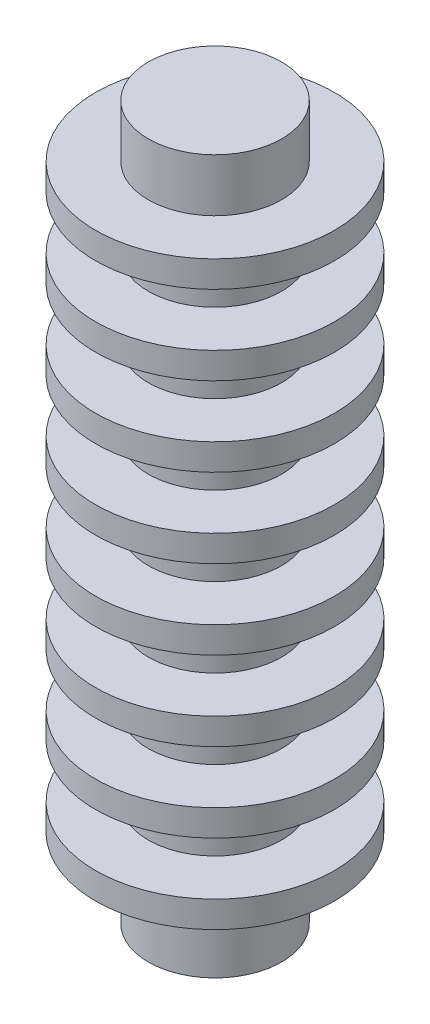
ISO-10303-21;
HEADER;
FILE_DESCRIPTION(('STEP AP214'),'2;1');
FILE_NAME('part.step','',(''),(''),'','','');
FILE_SCHEMA(('AUTOMOTIVE_DESIGN { 1 0 10303 214 1 1 1 1 }'));
ENDSEC;
DATA;
#1=APPLICATION_CONTEXT('core data for automotive mechanical design processes');
#2=APPLICATION_PROTOCOL_DEFINITION('international standard','automotive_design',2000,#1);
#3=PRODUCT_CONTEXT('',#1,'mechanical');
#4=PRODUCT('Part','Part','',(#3));
#5=PRODUCT_RELATED_PRODUCT_CATEGORY('part','',(#4));
#6=PRODUCT_DEFINITION_FORMATION('','',#4);
#7=PRODUCT_DEFINITION_CONTEXT('part definition',#1,'design');
#8=PRODUCT_DEFINITION('design','',#6,#7);
#9=PRODUCT_DEFINITION_SHAPE('','',#8);
#10=(LENGTH_UNIT() NAMED_UNIT(*) SI_UNIT(.MILLI.,.METRE.));
#11=(NAMED_UNIT(*) PLANE_ANGLE_UNIT() SI_UNIT($,.RADIAN.));
#12=(NAMED_UNIT(*) SI_UNIT($,.STERADIAN.) SOLID_ANGLE_UNIT());
#13=UNCERTAINTY_MEASURE_WITH_UNIT(LENGTH_MEASURE(1.E-05),#10,'distance_accuracy_value','');
#14=(GEOMETRIC_REPRESENTATION_CONTEXT(3) GLOBAL_UNCERTAINTY_ASSIGNED_CONTEXT((#13)) GLOBAL_UNIT_ASSIGNED_CONTEXT((#10,
#11,#12)) REPRESENTATION_CONTEXT('',''));
#15=CARTESIAN_POINT('',(0.,0.,0.));
#16=DIRECTION('',(0.,0.,1.));
#17=DIRECTION('',(1.,0.,0.));
#18=AXIS2_PLACEMENT_3D('',#15,#16,#17);
#19=CARTESIAN_POINT('',(5.05,27.,0.));
#20=DIRECTION('',(0.,-1.,0.));
#21=DIRECTION('',(1.,0.,0.));
#22=AXIS2_PLACEMENT_3D('',#19,#20,#21);
#23=PLANE('',#22);
#24=CARTESIAN_POINT('',(0.,27.,0.));
#25=DIRECTION('',(0.,1.,0.));
#26=DIRECTION('',(-1.,0.,0.));
#27=AXIS2_PLACEMENT_3D('',#24,#25,#26);
#28=CIRCLE('',#27,5.04999999999999);
#29=CARTESIAN_POINT('',(-5.04999999999998,27.,0.));
#30=VERTEX_POINT('',#29);
#31=EDGE_CURVE('E10',#30,#30,#28,.T.);
#32=ORIENTED_EDGE('',*,*,#31,.T.);
#33=EDGE_LOOP('',(#32));
#34=FACE_BOUND('',#33,.T.);
#35=ADVANCED_FACE('F41',(#34),#23,.F.);
#36=CARTESIAN_POINT('',(0.,27.,0.));
#37=DIRECTION('',(0.,1.,0.));
#38=DIRECTION('',(-1.,0.,0.));
#39=AXIS2_PLACEMENT_3D('',#36,#37,#38);
#40=CYLINDRICAL_SURFACE('',#39,5.04999999999999);
#41=ORIENTED_EDGE('',*,*,#31,.F.);
#42=EDGE_LOOP('',(#41));
#43=FACE_BOUND('',#42,.T.);
#44=CARTESIAN_POINT('',(0.,23.,0.));
#45=DIRECTION('',(0.,1.,0.));
#46=DIRECTION('',(-1.,0.,0.));
#47=AXIS2_PLACEMENT_3D('',#44,#45,#46);
#48=CIRCLE('',#47,5.04999999999999);
#49=CARTESIAN_POINT('',(-5.04999999999998,23.,0.));
#50=VERTEX_POINT('',#49);
#51=EDGE_CURVE('E47',#50,#50,#48,.T.);
#52=ORIENTED_EDGE('',*,*,#51,.T.);
#53=EDGE_LOOP('',(#52));
#54=FACE_BOUND('',#53,.T.);
#55=ADVANCED_FACE('F163',(#43,#54),#40,.T.);
#56=CARTESIAN_POINT('',(5.05,23.,0.));
#57=DIRECTION('',(0.,-1.,0.));
#58=DIRECTION('',(1.,0.,0.));
#59=AXIS2_PLACEMENT_3D('',#56,#57,#58);
#60=PLANE('',#59);
#61=ORIENTED_EDGE('',*,*,#51,.F.);
#62=EDGE_LOOP('',(#61));
#63=FACE_BOUND('',#62,.T.);
#64=CARTESIAN_POINT('',(0.,23.,0.));
#65=DIRECTION('',(0.,1.,0.));
#66=DIRECTION('',(-1.,0.,0.));
#67=AXIS2_PLACEMENT_3D('',#64,#65,#66);
#68=CIRCLE('',#67,9.04999999999999);
#69=CARTESIAN_POINT('',(-9.04999999999998,23.,0.));
#70=VERTEX_POINT('',#69);
#71=EDGE_CURVE('E51',#70,#70,#68,.T.);
#72=ORIENTED_EDGE('',*,*,#71,.T.);
#73=EDGE_LOOP('',(#72));
#74=FACE_BOUND('',#73,.T.);
#75=ADVANCED_FACE('F167',(#63,#74),#60,.F.);
#76=CARTESIAN_POINT('',(0.,27.,0.));
#77=DIRECTION('',(0.,1.,0.));
#78=DIRECTION('',(-1.,0.,0.));
#79=AXIS2_PLACEMENT_3D('',#76,#77,#78);
#80=CYLINDRICAL_SURFACE('',#79,9.05);
#81=ORIENTED_EDGE('',*,*,#71,.F.);
#82=EDGE_LOOP('',(#81));
#83=FACE_BOUND('',#82,.T.);
#84=CARTESIAN_POINT('',(0.,21.,0.));
#85=DIRECTION('',(0.,1.,0.));
#86=DIRECTION('',(-1.,0.,0.));
#87=AXIS2_PLACEMENT_3D('',#84,#85,#86);
#88=CIRCLE('',#87,9.04999999999999);
#89=CARTESIAN_POINT('',(-9.04999999999998,21.,0.));
#90=VERTEX_POINT('',#89);
#91=EDGE_CURVE('E55',#90,#90,#88,.T.);
#92=ORIENTED_EDGE('',*,*,#91,.T.);
#93=EDGE_LOOP('',(#92));
#94=FACE_BOUND('',#93,.T.);
#95=ADVANCED_FACE('F172',(#83,#94),#80,.T.);
#96=CARTESIAN_POINT('',(9.05,21.,0.));
#97=DIRECTION('',(0.,1.,0.));
#98=DIRECTION('',(-1.,0.,0.));
#99=AXIS2_PLACEMENT_3D('',#96,#97,#98);
#100=PLANE('',#99);
#101=ORIENTED_EDGE('',*,*,#91,.F.);
#102=EDGE_LOOP('',(#101));
#103=FACE_BOUND('',#102,.T.);
#104=CARTESIAN_POINT('',(0.,21.,0.));
#105=DIRECTION('',(0.,1.,0.));
#106=DIRECTION('',(-1.,0.,0.));
#107=AXIS2_PLACEMENT_3D('',#104,#105,#106);
#108=CIRCLE('',#107,5.04999999999999);
#109=CARTESIAN_POINT('',(-5.04999999999998,21.,0.));
#110=VERTEX_POINT('',#109);
#111=EDGE_CURVE('E60',#110,#110,#108,.T.);
#112=ORIENTED_EDGE('',*,*,#111,.T.);
#113=EDGE_LOOP('',(#112));
#114=FACE_BOUND('',#113,.T.);
#115=ADVANCED_FACE('F178',(#103,#114),#100,.F.);
#116=CARTESIAN_POINT('',(0.,27.,0.));
#117=DIRECTION('',(0.,1.,0.));
#118=DIRECTION('',(-1.,0.,0.));
#119=AXIS2_PLACEMENT_3D('',#116,#117,#118);
#120=CYLINDRICAL_SURFACE('',#119,5.04999999999981);
#121=ORIENTED_EDGE('',*,*,#111,.F.);
#122=EDGE_LOOP('',(#121));
#123=FACE_BOUND('',#122,.T.);
#124=CARTESIAN_POINT('',(0.,17.,0.));
#125=DIRECTION('',(0.,1.,0.));
#126=DIRECTION('',(-1.,0.,0.));
#127=AXIS2_PLACEMENT_3D('',#124,#125,#126);
#128=CIRCLE('',#127,5.05000000000005);
#129=CARTESIAN_POINT('',(-5.05000000000005,17.,0.));
#130=VERTEX_POINT('',#129);
#131=EDGE_CURVE('E63',#130,#130,#128,.T.);
#132=ORIENTED_EDGE('',*,*,#131,.T.);
#133=EDGE_LOOP('',(#132));
#134=FACE_BOUND('',#133,.T.);
#135=ADVANCED_FACE('F182',(#123,#134),#120,.T.);
#136=CARTESIAN_POINT('',(5.05000000000006,17.,0.));
#137=DIRECTION('',(0.,-1.,0.));
#138=DIRECTION('',(1.,0.,0.));
#139=AXIS2_PLACEMENT_3D('',#136,#137,#138);
#140=PLANE('',#139);
#141=ORIENTED_EDGE('',*,*,#131,.F.);
#142=EDGE_LOOP('',(#141));
#143=FACE_BOUND('',#142,.T.);
#144=CARTESIAN_POINT('',(0.,17.,0.));
#145=DIRECTION('',(0.,1.,0.));
#146=DIRECTION('',(-1.,0.,0.));
#147=AXIS2_PLACEMENT_3D('',#144,#145,#146);
#148=CIRCLE('',#147,9.05000000000006);
#149=CARTESIAN_POINT('',(-9.05000000000005,17.,0.));
#150=VERTEX_POINT('',#149);
#151=EDGE_CURVE('E66',#150,#150,#148,.T.);
#152=ORIENTED_EDGE('',*,*,#151,.T.);
#153=EDGE_LOOP('',(#152));
#154=FACE_BOUND('',#153,.T.);
#155=ADVANCED_FACE('F186',(#143,#154),#140,.F.);
#156=CARTESIAN_POINT('',(0.,27.,0.));
#157=DIRECTION('',(0.,1.,0.));
#158=DIRECTION('',(-1.,0.,0.));
#159=AXIS2_PLACEMENT_3D('',#156,#157,#158);
#160=CYLINDRICAL_SURFACE('',#159,9.05000000000006);
#161=ORIENTED_EDGE('',*,*,#151,.F.);
#162=EDGE_LOOP('',(#161));
#163=FACE_BOUND('',#162,.T.);
#164=CARTESIAN_POINT('',(0.,15.,0.));
#165=DIRECTION('',(0.,1.,0.));
#166=DIRECTION('',(-1.,0.,0.));
#167=AXIS2_PLACEMENT_3D('',#164,#165,#166);
#168=CIRCLE('',#167,9.05000000000006);
#169=CARTESIAN_POINT('',(-9.05000000000005,15.,0.));
#170=VERTEX_POINT('',#169);
#171=EDGE_CURVE('E69',#170,#170,#168,.T.);
#172=ORIENTED_EDGE('',*,*,#171,.T.);
#173=EDGE_LOOP('',(#172));
#174=FACE_BOUND('',#173,.T.);
#175=ADVANCED_FACE('F190',(#163,#174),#160,.T.);
#176=CARTESIAN_POINT('',(9.05000000000007,15.,0.));
#177=DIRECTION('',(0.,1.,0.));
#178=DIRECTION('',(-1.,0.,0.));
#179=AXIS2_PLACEMENT_3D('',#176,#177,#178);
#180=PLANE('',#179);
#181=ORIENTED_EDGE('',*,*,#171,.F.);
#182=EDGE_LOOP('',(#181));
#183=FACE_BOUND('',#182,.T.);
#184=CARTESIAN_POINT('',(0.,15.,0.));
#185=DIRECTION('',(0.,1.,0.));
#186=DIRECTION('',(-1.,0.,0.));
#187=AXIS2_PLACEMENT_3D('',#184,#185,#186);
#188=CIRCLE('',#187,5.05000000000005);
#189=CARTESIAN_POINT('',(-5.05000000000005,15.,0.));
#190=VERTEX_POINT('',#189);
#191=EDGE_CURVE('E72',#190,#190,#188,.T.);
#192=ORIENTED_EDGE('',*,*,#191,.T.);
#193=EDGE_LOOP('',(#192));
#194=FACE_BOUND('',#193,.T.);
#195=ADVANCED_FACE('F194',(#183,#194),#180,.F.);
#196=CARTESIAN_POINT('',(0.,27.,0.));
#197=DIRECTION('',(0.,1.,0.));
#198=DIRECTION('',(-1.,0.,0.));
#199=AXIS2_PLACEMENT_3D('',#196,#197,#198);
#200=CYLINDRICAL_SURFACE('',#199,5.05000000000012);
#201=ORIENTED_EDGE('',*,*,#191,.F.);
#202=EDGE_LOOP('',(#201));
#203=FACE_BOUND('',#202,.T.);
#204=CARTESIAN_POINT('',(0.,11.,0.));
#205=DIRECTION('',(0.,1.,0.));
#206=DIRECTION('',(-1.,0.,0.));
#207=AXIS2_PLACEMENT_3D('',#204,#205,#206);
#208=CIRCLE('',#207,5.05000000000012);
#209=CARTESIAN_POINT('',(-5.05000000000011,11.,0.));
#210=VERTEX_POINT('',#209);
#211=EDGE_CURVE('E75',#210,#210,#208,.T.);
#212=ORIENTED_EDGE('',*,*,#211,.T.);
#213=EDGE_LOOP('',(#212));
#214=FACE_BOUND('',#213,.T.);
#215=ADVANCED_FACE('F198',(#203,#214),#200,.T.);
#216=CARTESIAN_POINT('',(5.05000000000013,11.,0.));
#217=DIRECTION('',(0.,-1.,0.));
#218=DIRECTION('',(1.,0.,0.));
#219=AXIS2_PLACEMENT_3D('',#216,#217,#218);
#220=PLANE('',#219);
#221=ORIENTED_EDGE('',*,*,#211,.F.);
#222=EDGE_LOOP('',(#221));
#223=FACE_BOUND('',#222,.T.);
#224=CARTESIAN_POINT('',(0.,11.,0.));
#225=DIRECTION('',(0.,1.,0.));
#226=DIRECTION('',(-1.,0.,0.));
#227=AXIS2_PLACEMENT_3D('',#224,#225,#226);
#228=CIRCLE('',#227,9.05000000000012);
#229=CARTESIAN_POINT('',(-9.05000000000011,11.,0.));
#230=VERTEX_POINT('',#229);
#231=EDGE_CURVE('E78',#230,#230,#228,.T.);
#232=ORIENTED_EDGE('',*,*,#231,.T.);
#233=EDGE_LOOP('',(#232));
#234=FACE_BOUND('',#233,.T.);
#235=ADVANCED_FACE('F202',(#223,#234),#220,.F.);
#236=CARTESIAN_POINT('',(0.,27.,0.));
#237=DIRECTION('',(0.,1.,0.));
#238=DIRECTION('',(-1.,0.,0.));
#239=AXIS2_PLACEMENT_3D('',#236,#237,#238);
#240=CYLINDRICAL_SURFACE('',#239,9.05000000000012);
#241=ORIENTED_EDGE('',*,*,#231,.F.);
#242=EDGE_LOOP('',(#241));
#243=FACE_BOUND('',#242,.T.);
#244=CARTESIAN_POINT('',(0.,9.,0.));
#245=DIRECTION('',(0.,1.,0.));
#246=DIRECTION('',(-1.,0.,0.));
#247=AXIS2_PLACEMENT_3D('',#244,#245,#246);
#248=CIRCLE('',#247,9.05000000000012);
#249=CARTESIAN_POINT('',(-9.05000000000011,9.,0.));
#250=VERTEX_POINT('',#249);
#251=EDGE_CURVE('E81',#250,#250,#248,.T.);
#252=ORIENTED_EDGE('',*,*,#251,.T.);
#253=EDGE_LOOP('',(#252));
#254=FACE_BOUND('',#253,.T.);
#255=ADVANCED_FACE('F206',(#243,#254),#240,.T.);
#256=CARTESIAN_POINT('',(9.05000000000013,9.,0.));
#257=DIRECTION('',(0.,1.,0.));
#258=DIRECTION('',(-1.,0.,0.));
#259=AXIS2_PLACEMENT_3D('',#256,#257,#258);
#260=PLANE('',#259);
#261=ORIENTED_EDGE('',*,*,#251,.F.);
#262=EDGE_LOOP('',(#261));
#263=FACE_BOUND('',#262,.T.);
#264=CARTESIAN_POINT('',(0.,8.99999999999999,0.));
#265=DIRECTION('',(0.,1.,0.));
#266=DIRECTION('',(-1.,0.,0.));
#267=AXIS2_PLACEMENT_3D('',#264,#265,#266);
#268=CIRCLE('',#267,5.05000000000012);
#269=CARTESIAN_POINT('',(-5.05000000000011,8.99999999999999,0.));
#270=VERTEX_POINT('',#269);
#271=EDGE_CURVE('E84',#270,#270,#268,.T.);
#272=ORIENTED_EDGE('',*,*,#271,.T.);
#273=EDGE_LOOP('',(#272));
#274=FACE_BOUND('',#273,.T.);
#275=ADVANCED_FACE('F210',(#263,#274),#260,.F.);
#276=CARTESIAN_POINT('',(0.,27.,0.));
#277=DIRECTION('',(0.,1.,0.));
#278=DIRECTION('',(-1.,0.,0.));
#279=AXIS2_PLACEMENT_3D('',#276,#277,#278);
#280=CYLINDRICAL_SURFACE('',#279,5.05000000000018);
#281=ORIENTED_EDGE('',*,*,#271,.F.);
#282=EDGE_LOOP('',(#281));
#283=FACE_BOUND('',#282,.T.);
#284=CARTESIAN_POINT('',(0.,5.,0.));
#285=DIRECTION('',(0.,1.,0.));
#286=DIRECTION('',(-1.,0.,0.));
#287=AXIS2_PLACEMENT_3D('',#284,#285,#286);
#288=CIRCLE('',#287,5.05000000000018);
#289=CARTESIAN_POINT('',(-5.05000000000017,5.,0.));
#290=VERTEX_POINT('',#289);
#291=EDGE_CURVE('E87',#290,#290,#288,.T.);
#292=ORIENTED_EDGE('',*,*,#291,.T.);
#293=EDGE_LOOP('',(#292));
#294=FACE_BOUND('',#293,.T.);
#295=ADVANCED_FACE('F214',(#283,#294),#280,.T.);
#296=CARTESIAN_POINT('',(5.05000000000019,5.,0.));
#297=DIRECTION('',(0.,-1.,0.));
#298=DIRECTION('',(1.,0.,0.));
#299=AXIS2_PLACEMENT_3D('',#296,#297,#298);
#300=PLANE('',#299);
#301=ORIENTED_EDGE('',*,*,#291,.F.);
#302=EDGE_LOOP('',(#301));
#303=FACE_BOUND('',#302,.T.);
#304=CARTESIAN_POINT('',(0.,5.,0.));
#305=DIRECTION('',(0.,1.,0.));
#306=DIRECTION('',(-1.,0.,0.));
#307=AXIS2_PLACEMENT_3D('',#304,#305,#306);
#308=CIRCLE('',#307,9.05000000000019);
#309=CARTESIAN_POINT('',(-9.05000000000018,5.,0.));
#310=VERTEX_POINT('',#309);
#311=EDGE_CURVE('E90',#310,#310,#308,.T.);
#312=ORIENTED_EDGE('',*,*,#311,.T.);
#313=EDGE_LOOP('',(#312));
#314=FACE_BOUND('',#313,.T.);
#315=ADVANCED_FACE('F218',(#303,#314),#300,.F.);
#316=CARTESIAN_POINT('',(0.,27.,0.));
#317=DIRECTION('',(0.,1.,0.));
#318=DIRECTION('',(-1.,0.,0.));
#319=AXIS2_PLACEMENT_3D('',#316,#317,#318);
#320=CYLINDRICAL_SURFACE('',#319,9.05000000000019);
#321=ORIENTED_EDGE('',*,*,#311,.F.);
#322=EDGE_LOOP('',(#321));
#323=FACE_BOUND('',#322,.T.);
#324=CARTESIAN_POINT('',(0.,3.,0.));
#325=DIRECTION('',(0.,1.,0.));
#326=DIRECTION('',(-1.,0.,0.));
#327=AXIS2_PLACEMENT_3D('',#324,#325,#326);
#328=CIRCLE('',#327,9.05000000000019);
#329=CARTESIAN_POINT('',(-9.05000000000018,3.,0.));
#330=VERTEX_POINT('',#329);
#331=EDGE_CURVE('E93',#330,#330,#328,.T.);
#332=ORIENTED_EDGE('',*,*,#331,.T.);
#333=EDGE_LOOP('',(#332));
#334=FACE_BOUND('',#333,.T.);
#335=ADVANCED_FACE('F222',(#323,#334),#320,.T.);
#336=CARTESIAN_POINT('',(9.05000000000019,3.,0.));
#337=DIRECTION('',(0.,1.,0.));
#338=DIRECTION('',(-1.,0.,0.));
#339=AXIS2_PLACEMENT_3D('',#336,#337,#338);
#340=PLANE('',#339);
#341=ORIENTED_EDGE('',*,*,#331,.F.);
#342=EDGE_LOOP('',(#341));
#343=FACE_BOUND('',#342,.T.);
#344=CARTESIAN_POINT('',(0.,3.,0.));
#345=DIRECTION('',(0.,1.,0.));
#346=DIRECTION('',(-1.,0.,0.));
#347=AXIS2_PLACEMENT_3D('',#344,#345,#346);
#348=CIRCLE('',#347,5.05000000000018);
#349=CARTESIAN_POINT('',(-5.05000000000017,3.,0.));
#350=VERTEX_POINT('',#349);
#351=EDGE_CURVE('E96',#350,#350,#348,.T.);
#352=ORIENTED_EDGE('',*,*,#351,.T.);
#353=EDGE_LOOP('',(#352));
#354=FACE_BOUND('',#353,.T.);
#355=ADVANCED_FACE('F226',(#343,#354),#340,.F.);
#356=CARTESIAN_POINT('',(0.,27.,0.));
#357=DIRECTION('',(0.,1.,0.));
#358=DIRECTION('',(-1.,0.,0.));
#359=AXIS2_PLACEMENT_3D('',#356,#357,#358);
#360=CYLINDRICAL_SURFACE('',#359,5.05000000000024);
#361=ORIENTED_EDGE('',*,*,#351,.F.);
#362=EDGE_LOOP('',(#361));
#363=FACE_BOUND('',#362,.T.);
#364=CARTESIAN_POINT('',(0.,-1.,0.));
#365=DIRECTION('',(0.,1.,0.));
#366=DIRECTION('',(-1.,0.,0.));
#367=AXIS2_PLACEMENT_3D('',#364,#365,#366);
#368=CIRCLE('',#367,5.05000000000024);
#369=CARTESIAN_POINT('',(-5.05000000000024,-1.,0.));
#370=VERTEX_POINT('',#369);
#371=EDGE_CURVE('E99',#370,#370,#368,.T.);
#372=ORIENTED_EDGE('',*,*,#371,.T.);
#373=EDGE_LOOP('',(#372));
#374=FACE_BOUND('',#373,.T.);
#375=ADVANCED_FACE('F230',(#363,#374),#360,.T.);
#376=CARTESIAN_POINT('',(5.05000000000025,-1.,0.));
#377=DIRECTION('',(0.,-1.,0.));
#378=DIRECTION('',(1.,0.,0.));
#379=AXIS2_PLACEMENT_3D('',#376,#377,#378);
#380=PLANE('',#379);
#381=ORIENTED_EDGE('',*,*,#371,.F.);
#382=EDGE_LOOP('',(#381));
#383=FACE_BOUND('',#382,.T.);
#384=CARTESIAN_POINT('',(0.,-1.,0.));
#385=DIRECTION('',(0.,1.,0.));
#386=DIRECTION('',(-1.,0.,0.));
#387=AXIS2_PLACEMENT_3D('',#384,#385,#386);
#388=CIRCLE('',#387,9.05000000000025);
#389=CARTESIAN_POINT('',(-9.05000000000024,-1.,0.));
#390=VERTEX_POINT('',#389);
#391=EDGE_CURVE('E102',#390,#390,#388,.T.);
#392=ORIENTED_EDGE('',*,*,#391,.T.);
#393=EDGE_LOOP('',(#392));
#394=FACE_BOUND('',#393,.T.);
#395=ADVANCED_FACE('F234',(#383,#394),#380,.F.);
#396=CARTESIAN_POINT('',(0.,27.,0.));
#397=DIRECTION('',(0.,1.,0.));
#398=DIRECTION('',(-1.,0.,0.));
#399=AXIS2_PLACEMENT_3D('',#396,#397,#398);
#400=CYLINDRICAL_SURFACE('',#399,9.05000000000025);
#401=ORIENTED_EDGE('',*,*,#391,.F.);
#402=EDGE_LOOP('',(#401));
#403=FACE_BOUND('',#402,.T.);
#404=CARTESIAN_POINT('',(0.,-3.,0.));
#405=DIRECTION('',(0.,1.,0.));
#406=DIRECTION('',(-1.,0.,0.));
#407=AXIS2_PLACEMENT_3D('',#404,#405,#406);
#408=CIRCLE('',#407,9.05000000000025);
#409=CARTESIAN_POINT('',(-9.05000000000024,-3.,0.));
#410=VERTEX_POINT('',#409);
#411=EDGE_CURVE('E105',#410,#410,#408,.T.);
#412=ORIENTED_EDGE('',*,*,#411,.T.);
#413=EDGE_LOOP('',(#412));
#414=FACE_BOUND('',#413,.T.);
#415=ADVANCED_FACE('F238',(#403,#414),#400,.T.);
#416=CARTESIAN_POINT('',(9.05000000000025,-3.,0.));
#417=DIRECTION('',(0.,1.,0.));
#418=DIRECTION('',(-1.,0.,0.));
#419=AXIS2_PLACEMENT_3D('',#416,#417,#418);
#420=PLANE('',#419);
#421=ORIENTED_EDGE('',*,*,#411,.F.);
#422=EDGE_LOOP('',(#421));
#423=FACE_BOUND('',#422,.T.);
#424=CARTESIAN_POINT('',(0.,-3.,0.));
#425=DIRECTION('',(0.,1.,0.));
#426=DIRECTION('',(-1.,0.,0.));
#427=AXIS2_PLACEMENT_3D('',#424,#425,#426);
#428=CIRCLE('',#427,5.05000000000024);
#429=CARTESIAN_POINT('',(-5.05000000000024,-3.,0.));
#430=VERTEX_POINT('',#429);
#431=EDGE_CURVE('E108',#430,#430,#428,.T.);
#432=ORIENTED_EDGE('',*,*,#431,.T.);
#433=EDGE_LOOP('',(#432));
#434=FACE_BOUND('',#433,.T.);
#435=ADVANCED_FACE('F242',(#423,#434),#420,.F.);
#436=CARTESIAN_POINT('',(0.,27.,0.));
#437=DIRECTION('',(0.,1.,0.));
#438=DIRECTION('',(-1.,0.,0.));
#439=AXIS2_PLACEMENT_3D('',#436,#437,#438);
#440=CYLINDRICAL_SURFACE('',#439,5.05000000000031);
#441=ORIENTED_EDGE('',*,*,#431,.F.);
#442=EDGE_LOOP('',(#441));
#443=FACE_BOUND('',#442,.T.);
#444=CARTESIAN_POINT('',(0.,-7.,0.));
#445=DIRECTION('',(0.,1.,0.));
#446=DIRECTION('',(-1.,0.,0.));
#447=AXIS2_PLACEMENT_3D('',#444,#445,#446);
#448=CIRCLE('',#447,5.05000000000031);
#449=CARTESIAN_POINT('',(-5.0500000000003,-6.99999999999999,0.));
#450=VERTEX_POINT('',#449);
#451=EDGE_CURVE('E111',#450,#450,#448,.T.);
#452=ORIENTED_EDGE('',*,*,#451,.T.);
#453=EDGE_LOOP('',(#452));
#454=FACE_BOUND('',#453,.T.);
#455=ADVANCED_FACE('F246',(#443,#454),#440,.T.);
#456=CARTESIAN_POINT('',(5.05000000000031,-7.,0.));
#457=DIRECTION('',(0.,-1.,0.));
#458=DIRECTION('',(1.,0.,0.));
#459=AXIS2_PLACEMENT_3D('',#456,#457,#458);
#460=PLANE('',#459);
#461=ORIENTED_EDGE('',*,*,#451,.F.);
#462=EDGE_LOOP('',(#461));
#463=FACE_BOUND('',#462,.T.);
#464=CARTESIAN_POINT('',(0.,-7.,0.));
#465=DIRECTION('',(0.,1.,0.));
#466=DIRECTION('',(-1.,0.,0.));
#467=AXIS2_PLACEMENT_3D('',#464,#465,#466);
#468=CIRCLE('',#467,9.05000000000031);
#469=CARTESIAN_POINT('',(-9.05000000000031,-6.99999999999999,0.));
#470=VERTEX_POINT('',#469);
#471=EDGE_CURVE('E114',#470,#470,#468,.T.);
#472=ORIENTED_EDGE('',*,*,#471,.T.);
#473=EDGE_LOOP('',(#472));
#474=FACE_BOUND('',#473,.T.);
#475=ADVANCED_FACE('F250',(#463,#474),#460,.F.);
#476=CARTESIAN_POINT('',(0.,27.,0.));
#477=DIRECTION('',(0.,1.,0.));
#478=DIRECTION('',(-1.,0.,0.));
#479=AXIS2_PLACEMENT_3D('',#476,#477,#478);
#480=CYLINDRICAL_SURFACE('',#479,9.05000000000031);
#481=ORIENTED_EDGE('',*,*,#471,.F.);
#482=EDGE_LOOP('',(#481));
#483=FACE_BOUND('',#482,.T.);
#484=CARTESIAN_POINT('',(0.,-9.,0.));
#485=DIRECTION('',(0.,1.,0.));
#486=DIRECTION('',(-1.,0.,0.));
#487=AXIS2_PLACEMENT_3D('',#484,#485,#486);
#488=CIRCLE('',#487,9.05000000000031);
#489=CARTESIAN_POINT('',(-9.05000000000031,-9.,0.));
#490=VERTEX_POINT('',#489);
#491=EDGE_CURVE('E117',#490,#490,#488,.T.);
#492=ORIENTED_EDGE('',*,*,#491,.T.);
#493=EDGE_LOOP('',(#492));
#494=FACE_BOUND('',#493,.T.);
#495=ADVANCED_FACE('F254',(#483,#494),#480,.T.);
#496=CARTESIAN_POINT('',(9.05000000000032,-9.,0.));
#497=DIRECTION('',(0.,1.,0.));
#498=DIRECTION('',(-1.,0.,0.));
#499=AXIS2_PLACEMENT_3D('',#496,#497,#498);
#500=PLANE('',#499);
#501=ORIENTED_EDGE('',*,*,#491,.F.);
#502=EDGE_LOOP('',(#501));
#503=FACE_BOUND('',#502,.T.);
#504=CARTESIAN_POINT('',(0.,-9.,0.));
#505=DIRECTION('',(0.,1.,0.));
#506=DIRECTION('',(-1.,0.,0.));
#507=AXIS2_PLACEMENT_3D('',#504,#505,#506);
#508=CIRCLE('',#507,5.05000000000031);
#509=CARTESIAN_POINT('',(-5.0500000000003,-9.,0.));
#510=VERTEX_POINT('',#509);
#511=EDGE_CURVE('E120',#510,#510,#508,.T.);
#512=ORIENTED_EDGE('',*,*,#511,.T.);
#513=EDGE_LOOP('',(#512));
#514=FACE_BOUND('',#513,.T.);
#515=ADVANCED_FACE('F258',(#503,#514),#500,.F.);
#516=CARTESIAN_POINT('',(0.,27.,0.));
#517=DIRECTION('',(0.,1.,0.));
#518=DIRECTION('',(-1.,0.,0.));
#519=AXIS2_PLACEMENT_3D('',#516,#517,#518);
#520=CYLINDRICAL_SURFACE('',#519,5.05000000000037);
#521=ORIENTED_EDGE('',*,*,#511,.F.);
#522=EDGE_LOOP('',(#521));
#523=FACE_BOUND('',#522,.T.);
#524=CARTESIAN_POINT('',(0.,-13.,0.));
#525=DIRECTION('',(0.,1.,0.));
#526=DIRECTION('',(-1.,0.,0.));
#527=AXIS2_PLACEMENT_3D('',#524,#525,#526);
#528=CIRCLE('',#527,5.05000000000037);
#529=CARTESIAN_POINT('',(-5.05000000000036,-13.,0.));
#530=VERTEX_POINT('',#529);
#531=EDGE_CURVE('E123',#530,#530,#528,.T.);
#532=ORIENTED_EDGE('',*,*,#531,.T.);
#533=EDGE_LOOP('',(#532));
#534=FACE_BOUND('',#533,.T.);
#535=ADVANCED_FACE('F262',(#523,#534),#520,.T.);
#536=CARTESIAN_POINT('',(5.05000000000037,-13.,0.));
#537=DIRECTION('',(0.,-1.,0.));
#538=DIRECTION('',(1.,0.,0.));
#539=AXIS2_PLACEMENT_3D('',#536,#537,#538);
#540=PLANE('',#539);
#541=ORIENTED_EDGE('',*,*,#531,.F.);
#542=EDGE_LOOP('',(#541));
#543=FACE_BOUND('',#542,.T.);
#544=CARTESIAN_POINT('',(0.,-13.,0.));
#545=DIRECTION('',(0.,1.,0.));
#546=DIRECTION('',(-1.,0.,0.));
#547=AXIS2_PLACEMENT_3D('',#544,#545,#546);
#548=CIRCLE('',#547,9.05000000000037);
#549=CARTESIAN_POINT('',(-9.05000000000037,-13.,0.));
#550=VERTEX_POINT('',#549);
#551=EDGE_CURVE('E126',#550,#550,#548,.T.);
#552=ORIENTED_EDGE('',*,*,#551,.T.);
#553=EDGE_LOOP('',(#552));
#554=FACE_BOUND('',#553,.T.);
#555=ADVANCED_FACE('F266',(#543,#554),#540,.F.);
#556=CARTESIAN_POINT('',(0.,27.,0.));
#557=DIRECTION('',(0.,1.,0.));
#558=DIRECTION('',(-1.,0.,0.));
#559=AXIS2_PLACEMENT_3D('',#556,#557,#558);
#560=CYLINDRICAL_SURFACE('',#559,9.05000000000037);
#561=ORIENTED_EDGE('',*,*,#551,.F.);
#562=EDGE_LOOP('',(#561));
#563=FACE_BOUND('',#562,.T.);
#564=CARTESIAN_POINT('',(0.,-15.,0.));
#565=DIRECTION('',(0.,1.,0.));
#566=DIRECTION('',(-1.,0.,0.));
#567=AXIS2_PLACEMENT_3D('',#564,#565,#566);
#568=CIRCLE('',#567,9.05000000000037);
#569=CARTESIAN_POINT('',(-9.05000000000037,-15.,0.));
#570=VERTEX_POINT('',#569);
#571=EDGE_CURVE('E129',#570,#570,#568,.T.);
#572=ORIENTED_EDGE('',*,*,#571,.T.);
#573=EDGE_LOOP('',(#572));
#574=FACE_BOUND('',#573,.T.);
#575=ADVANCED_FACE('F270',(#563,#574),#560,.T.);
#576=CARTESIAN_POINT('',(9.05000000000038,-15.,0.));
#577=DIRECTION('',(0.,1.,0.));
#578=DIRECTION('',(-1.,0.,0.));
#579=AXIS2_PLACEMENT_3D('',#576,#577,#578);
#580=PLANE('',#579);
#581=ORIENTED_EDGE('',*,*,#571,.F.);
#582=EDGE_LOOP('',(#581));
#583=FACE_BOUND('',#582,.T.);
#584=CARTESIAN_POINT('',(0.,-15.,0.));
#585=DIRECTION('',(0.,1.,0.));
#586=DIRECTION('',(-1.,0.,0.));
#587=AXIS2_PLACEMENT_3D('',#584,#585,#586);
#588=CIRCLE('',#587,5.05000000000037);
#589=CARTESIAN_POINT('',(-5.05000000000037,-15.,0.));
#590=VERTEX_POINT('',#589);
#591=EDGE_CURVE('E132',#590,#590,#588,.T.);
#592=ORIENTED_EDGE('',*,*,#591,.T.);
#593=EDGE_LOOP('',(#592));
#594=FACE_BOUND('',#593,.T.);
#595=ADVANCED_FACE('F274',(#583,#594),#580,.F.);
#596=CARTESIAN_POINT('',(0.,27.,0.));
#597=DIRECTION('',(0.,1.,0.));
#598=DIRECTION('',(-1.,0.,0.));
#599=AXIS2_PLACEMENT_3D('',#596,#597,#598);
#600=CYLINDRICAL_SURFACE('',#599,5.05000000000043);
#601=ORIENTED_EDGE('',*,*,#591,.F.);
#602=EDGE_LOOP('',(#601));
#603=FACE_BOUND('',#602,.T.);
#604=CARTESIAN_POINT('',(0.,-19.,0.));
#605=DIRECTION('',(0.,1.,0.));
#606=DIRECTION('',(-1.,0.,0.));
#607=AXIS2_PLACEMENT_3D('',#604,#605,#606);
#608=CIRCLE('',#607,5.05000000000043);
#609=CARTESIAN_POINT('',(-5.05000000000043,-19.,0.));
#610=VERTEX_POINT('',#609);
#611=EDGE_CURVE('E135',#610,#610,#608,.T.);
#612=ORIENTED_EDGE('',*,*,#611,.T.);
#613=EDGE_LOOP('',(#612));
#614=FACE_BOUND('',#613,.T.);
#615=ADVANCED_FACE('F278',(#603,#614),#600,.T.);
#616=CARTESIAN_POINT('',(5.05000000000044,-19.,0.));
#617=DIRECTION('',(0.,-1.,0.));
#618=DIRECTION('',(1.,0.,0.));
#619=AXIS2_PLACEMENT_3D('',#616,#617,#618);
#620=PLANE('',#619);
#621=ORIENTED_EDGE('',*,*,#611,.F.);
#622=EDGE_LOOP('',(#621));
#623=FACE_BOUND('',#622,.T.);
#624=CARTESIAN_POINT('',(0.,-19.,0.));
#625=DIRECTION('',(0.,1.,0.));
#626=DIRECTION('',(-1.,0.,0.));
#627=AXIS2_PLACEMENT_3D('',#624,#625,#626);
#628=CIRCLE('',#627,9.05000000000044);
#629=CARTESIAN_POINT('',(-9.05000000000043,-19.,0.));
#630=VERTEX_POINT('',#629);
#631=EDGE_CURVE('E138',#630,#630,#628,.T.);
#632=ORIENTED_EDGE('',*,*,#631,.T.);
#633=EDGE_LOOP('',(#632));
#634=FACE_BOUND('',#633,.T.);
#635=ADVANCED_FACE('F282',(#623,#634),#620,.F.);
#636=CARTESIAN_POINT('',(0.,27.,0.));
#637=DIRECTION('',(0.,1.,0.));
#638=DIRECTION('',(-1.,0.,0.));
#639=AXIS2_PLACEMENT_3D('',#636,#637,#638);
#640=CYLINDRICAL_SURFACE('',#639,9.05000000000044);
#641=ORIENTED_EDGE('',*,*,#631,.F.);
#642=EDGE_LOOP('',(#641));
#643=FACE_BOUND('',#642,.T.);
#644=CARTESIAN_POINT('',(0.,-21.,0.));
#645=DIRECTION('',(0.,1.,0.));
#646=DIRECTION('',(-1.,0.,0.));
#647=AXIS2_PLACEMENT_3D('',#644,#645,#646);
#648=CIRCLE('',#647,9.05000000000044);
#649=CARTESIAN_POINT('',(-9.05000000000043,-21.,0.));
#650=VERTEX_POINT('',#649);
#651=EDGE_CURVE('E141',#650,#650,#648,.T.);
#652=ORIENTED_EDGE('',*,*,#651,.T.);
#653=EDGE_LOOP('',(#652));
#654=FACE_BOUND('',#653,.T.);
#655=ADVANCED_FACE('F286',(#643,#654),#640,.T.);
#656=CARTESIAN_POINT('',(9.05000000000044,-21.,0.));
#657=DIRECTION('',(0.,1.,0.));
#658=DIRECTION('',(-1.,0.,0.));
#659=AXIS2_PLACEMENT_3D('',#656,#657,#658);
#660=PLANE('',#659);
#661=ORIENTED_EDGE('',*,*,#651,.F.);
#662=EDGE_LOOP('',(#661));
#663=FACE_BOUND('',#662,.T.);
#664=CARTESIAN_POINT('',(0.,-21.,0.));
#665=DIRECTION('',(0.,1.,0.));
#666=DIRECTION('',(-1.,0.,0.));
#667=AXIS2_PLACEMENT_3D('',#664,#665,#666);
#668=CIRCLE('',#667,5.05000000000043);
#669=CARTESIAN_POINT('',(-5.05000000000043,-21.,0.));
#670=VERTEX_POINT('',#669);
#671=EDGE_CURVE('E144',#670,#670,#668,.T.);
#672=ORIENTED_EDGE('',*,*,#671,.T.);
#673=EDGE_LOOP('',(#672));
#674=FACE_BOUND('',#673,.T.);
#675=ADVANCED_FACE('F159',(#663,#674),#660,.F.);
#676=CARTESIAN_POINT('',(0.,27.,0.));
#677=DIRECTION('',(0.,1.,0.));
#678=DIRECTION('',(-1.,0.,0.));
#679=AXIS2_PLACEMENT_3D('',#676,#677,#678);
#680=CYLINDRICAL_SURFACE('',#679,5.05);
#681=ORIENTED_EDGE('',*,*,#671,.F.);
#682=EDGE_LOOP('',(#681));
#683=FACE_BOUND('',#682,.T.);
#684=CARTESIAN_POINT('',(0.,-27.,0.));
#685=DIRECTION('',(0.,1.,0.));
#686=DIRECTION('',(-1.,0.,0.));
#687=AXIS2_PLACEMENT_3D('',#684,#685,#686);
#688=CIRCLE('',#687,5.05);
#689=CARTESIAN_POINT('',(-5.05,-27.,0.));
#690=VERTEX_POINT('',#689);
#691=EDGE_CURVE('E147',#690,#690,#688,.T.);
#692=ORIENTED_EDGE('',*,*,#691,.T.);
#693=EDGE_LOOP('',(#692));
#694=FACE_BOUND('',#693,.T.);
#695=ADVANCED_FACE('F151',(#683,#694),#680,.T.);
#696=CARTESIAN_POINT('',(5.05000000000001,-27.,0.));
#697=DIRECTION('',(0.,1.,0.));
#698=DIRECTION('',(-1.,0.,0.));
#699=AXIS2_PLACEMENT_3D('',#696,#697,#698);
#700=PLANE('',#699);
#701=ORIENTED_EDGE('',*,*,#691,.F.);
#702=EDGE_LOOP('',(#701));
#703=FACE_BOUND('',#702,.T.);
#704=ADVANCED_FACE('F153',(#703),#700,.F.);
#705=CLOSED_SHELL('',(#35,#55,#75,#95,#115,#135,#155,#175,#195,#215,#235,#255,#275,#295,#315,
#335,#355,#375,#395,#415,#435,#455,#475,#495,#515,#535,#555,#575,#595,#615,#635,#655,#675,#695,#704));
#706=MANIFOLD_SOLID_BREP('B2',#705);
#707=ADVANCED_BREP_SHAPE_REPRESENTATION('',(#18,#706),#14);
#708=SHAPE_DEFINITION_REPRESENTATION(#9,#707);
ENDSEC;
END-ISO-10303-21;
